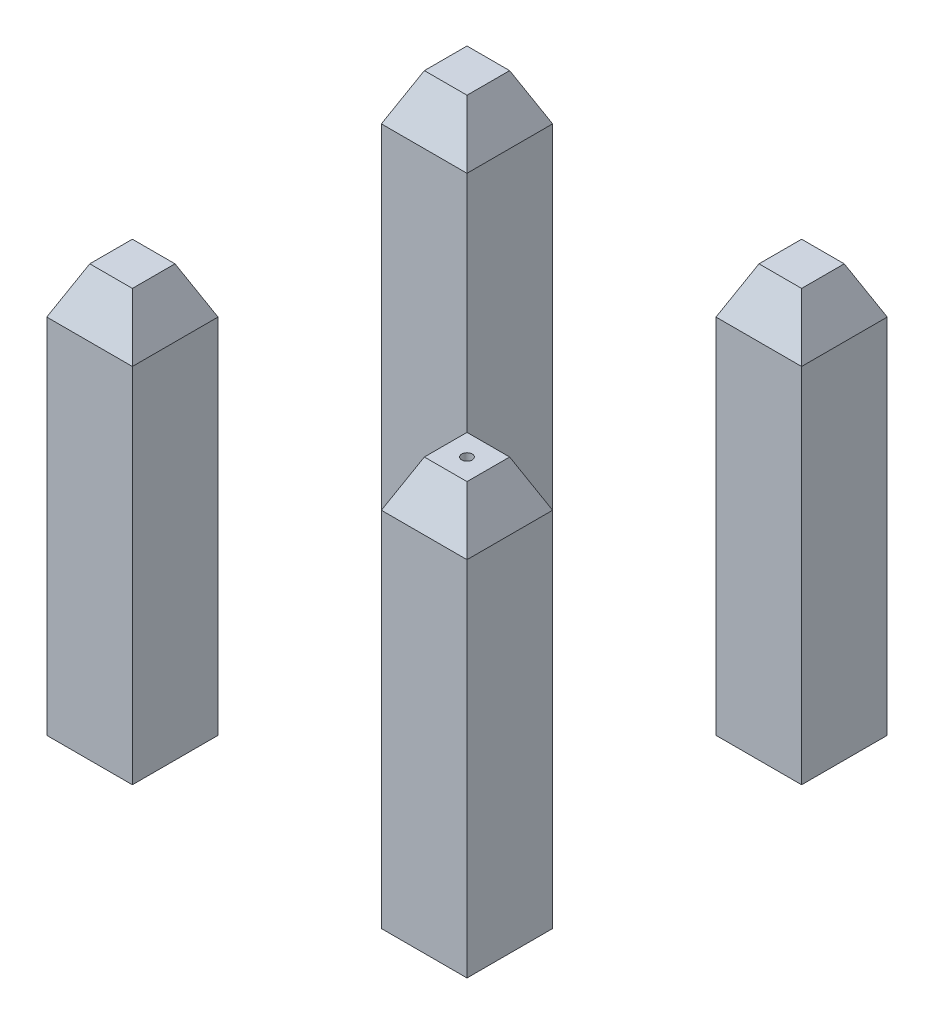
ISO-10303-21;
HEADER;
FILE_DESCRIPTION(('STEP AP214'),'2;1');
FILE_NAME('part.step','',(''),(''),'','','');
FILE_SCHEMA(('AUTOMOTIVE_DESIGN { 1 0 10303 214 1 1 1 1 }'));
ENDSEC;
DATA;
#1=APPLICATION_CONTEXT('core data for automotive mechanical design processes');
#2=APPLICATION_PROTOCOL_DEFINITION('international standard','automotive_design',2000,#1);
#3=PRODUCT_CONTEXT('',#1,'mechanical');
#4=PRODUCT('Part','Part','',(#3));
#5=PRODUCT_RELATED_PRODUCT_CATEGORY('part','',(#4));
#6=PRODUCT_DEFINITION_FORMATION('','',#4);
#7=PRODUCT_DEFINITION_CONTEXT('part definition',#1,'design');
#8=PRODUCT_DEFINITION('design','',#6,#7);
#9=PRODUCT_DEFINITION_SHAPE('','',#8);
#10=(LENGTH_UNIT() NAMED_UNIT(*) SI_UNIT(.MILLI.,.METRE.));
#11=(NAMED_UNIT(*) PLANE_ANGLE_UNIT() SI_UNIT($,.RADIAN.));
#12=(NAMED_UNIT(*) SI_UNIT($,.STERADIAN.) SOLID_ANGLE_UNIT());
#13=UNCERTAINTY_MEASURE_WITH_UNIT(LENGTH_MEASURE(1.E-05),#10,'distance_accuracy_value','');
#14=(GEOMETRIC_REPRESENTATION_CONTEXT(3) GLOBAL_UNCERTAINTY_ASSIGNED_CONTEXT((#13)) GLOBAL_UNIT_ASSIGNED_CONTEXT((#10,
#11,#12)) REPRESENTATION_CONTEXT('',''));
#15=CARTESIAN_POINT('',(0.,0.,0.));
#16=DIRECTION('',(0.,0.,1.));
#17=DIRECTION('',(1.,0.,0.));
#18=AXIS2_PLACEMENT_3D('',#15,#16,#17);
#19=CARTESIAN_POINT('',(-0.325,5.6,-0.325));
#20=DIRECTION('',(1.,0.,0.));
#21=DIRECTION('',(0.,0.,-1.));
#22=AXIS2_PLACEMENT_3D('',#19,#20,#21);
#23=PLANE('',#22);
#24=DIRECTION('',(0.,-1.,0.));
#25=VECTOR('',#24,1.);
#26=CARTESIAN_POINT('',(-0.325,5.6,-0.325));
#27=LINE('',#26,#25);
#28=CARTESIAN_POINT('',(-0.325,5.25,-0.325));
#29=VERTEX_POINT('',#28);
#30=CARTESIAN_POINT('',(-0.325,2.5,-0.325));
#31=VERTEX_POINT('',#30);
#32=EDGE_CURVE('E134',#29,#31,#27,.T.);
#33=ORIENTED_EDGE('',*,*,#32,.T.);
#34=DIRECTION('',(0.,0.,1.));
#35=VECTOR('',#34,1.);
#36=CARTESIAN_POINT('',(-0.325,2.5,-0.325));
#37=LINE('',#36,#35);
#38=CARTESIAN_POINT('',(-0.325,2.5,0.325));
#39=VERTEX_POINT('',#38);
#40=EDGE_CURVE('E75',#31,#39,#37,.T.);
#41=ORIENTED_EDGE('',*,*,#40,.T.);
#42=DIRECTION('',(0.,-1.,0.));
#43=VECTOR('',#42,1.);
#44=CARTESIAN_POINT('',(-0.325,5.6,0.325));
#45=LINE('',#44,#43);
#46=CARTESIAN_POINT('',(-0.325,5.25,0.325));
#47=VERTEX_POINT('',#46);
#48=EDGE_CURVE('E147',#47,#39,#45,.T.);
#49=ORIENTED_EDGE('',*,*,#48,.F.);
#50=DIRECTION('',(0.,0.,-1.));
#51=VECTOR('',#50,1.);
#52=CARTESIAN_POINT('',(-0.325,5.25,-0.325));
#53=LINE('',#52,#51);
#54=EDGE_CURVE('E143',#47,#29,#53,.T.);
#55=ORIENTED_EDGE('',*,*,#54,.T.);
#56=EDGE_LOOP('',(#33,#41,#49,#55));
#57=FACE_BOUND('',#56,.T.);
#58=ADVANCED_FACE('F55',(#57),#23,.F.);
#59=CARTESIAN_POINT('',(-0.325,5.6,0.325));
#60=DIRECTION('',(0.,0.,-1.));
#61=DIRECTION('',(-1.,0.,0.));
#62=AXIS2_PLACEMENT_3D('',#59,#60,#61);
#63=PLANE('',#62);
#64=ORIENTED_EDGE('',*,*,#48,.T.);
#65=DIRECTION('',(1.,0.,0.));
#66=VECTOR('',#65,1.);
#67=CARTESIAN_POINT('',(-0.325,2.5,0.325));
#68=LINE('',#67,#66);
#69=CARTESIAN_POINT('',(0.325,2.5,0.325000000000001));
#70=VERTEX_POINT('',#69);
#71=EDGE_CURVE('E144',#39,#70,#68,.T.);
#72=ORIENTED_EDGE('',*,*,#71,.T.);
#73=DIRECTION('',(0.,-1.,0.));
#74=VECTOR('',#73,1.);
#75=CARTESIAN_POINT('',(0.325,5.6,0.325));
#76=LINE('',#75,#74);
#77=CARTESIAN_POINT('',(0.325,5.25,0.325));
#78=VERTEX_POINT('',#77);
#79=EDGE_CURVE('E119',#78,#70,#76,.T.);
#80=ORIENTED_EDGE('',*,*,#79,.F.);
#81=DIRECTION('',(-1.,0.,0.));
#82=VECTOR('',#81,1.);
#83=CARTESIAN_POINT('',(-0.325,5.25,0.325));
#84=LINE('',#83,#82);
#85=EDGE_CURVE('E146',#78,#47,#84,.T.);
#86=ORIENTED_EDGE('',*,*,#85,.T.);
#87=EDGE_LOOP('',(#64,#72,#80,#86));
#88=FACE_BOUND('',#87,.T.);
#89=ADVANCED_FACE('F194',(#88),#63,.F.);
#90=CARTESIAN_POINT('',(0.325,5.6,-0.325));
#91=DIRECTION('',(-1.,0.,0.));
#92=DIRECTION('',(0.,0.,1.));
#93=AXIS2_PLACEMENT_3D('',#90,#91,#92);
#94=PLANE('',#93);
#95=ORIENTED_EDGE('',*,*,#79,.T.);
#96=DIRECTION('',(0.,0.,-1.));
#97=VECTOR('',#96,1.);
#98=CARTESIAN_POINT('',(0.325,2.5,-0.325));
#99=LINE('',#98,#97);
#100=CARTESIAN_POINT('',(0.325,2.5,-0.325));
#101=VERTEX_POINT('',#100);
#102=EDGE_CURVE('E105',#70,#101,#99,.T.);
#103=ORIENTED_EDGE('',*,*,#102,.T.);
#104=DIRECTION('',(0.,-1.,0.));
#105=VECTOR('',#104,1.);
#106=CARTESIAN_POINT('',(0.325,5.6,-0.325));
#107=LINE('',#106,#105);
#108=CARTESIAN_POINT('',(0.325,5.25,-0.325));
#109=VERTEX_POINT('',#108);
#110=EDGE_CURVE('E113',#109,#101,#107,.T.);
#111=ORIENTED_EDGE('',*,*,#110,.F.);
#112=DIRECTION('',(0.,0.,1.));
#113=VECTOR('',#112,1.);
#114=CARTESIAN_POINT('',(0.325,5.25,0.325));
#115=LINE('',#114,#113);
#116=EDGE_CURVE('E121',#109,#78,#115,.T.);
#117=ORIENTED_EDGE('',*,*,#116,.T.);
#118=EDGE_LOOP('',(#95,#103,#111,#117));
#119=FACE_BOUND('',#118,.T.);
#120=ADVANCED_FACE('F117',(#119),#94,.F.);
#121=CARTESIAN_POINT('',(-0.325,5.6,-0.325));
#122=DIRECTION('',(0.,0.,1.));
#123=DIRECTION('',(1.,0.,0.));
#124=AXIS2_PLACEMENT_3D('',#121,#122,#123);
#125=PLANE('',#124);
#126=ORIENTED_EDGE('',*,*,#110,.T.);
#127=DIRECTION('',(-1.,0.,0.));
#128=VECTOR('',#127,1.);
#129=CARTESIAN_POINT('',(-0.325,2.5,-0.325));
#130=LINE('',#129,#128);
#131=EDGE_CURVE('E59',#101,#31,#130,.T.);
#132=ORIENTED_EDGE('',*,*,#131,.T.);
#133=ORIENTED_EDGE('',*,*,#32,.F.);
#134=DIRECTION('',(1.,0.,0.));
#135=VECTOR('',#134,1.);
#136=CARTESIAN_POINT('',(0.325,5.25,-0.325));
#137=LINE('',#136,#135);
#138=EDGE_CURVE('E112',#29,#109,#137,.T.);
#139=ORIENTED_EDGE('',*,*,#138,.T.);
#140=EDGE_LOOP('',(#126,#132,#133,#139));
#141=FACE_BOUND('',#140,.T.);
#142=ADVANCED_FACE('F123',(#141),#125,.F.);
#143=CARTESIAN_POINT('',(-0.325,5.6,0.325));
#144=DIRECTION('',(0.,1.,0.));
#145=DIRECTION('',(0.,0.,1.));
#146=AXIS2_PLACEMENT_3D('',#143,#144,#145);
#147=PLANE('',#146);
#148=CARTESIAN_POINT('',(0.,5.6,0.));
#149=DIRECTION('',(0.,1.,0.));
#150=DIRECTION('',(0.,0.,1.));
#151=AXIS2_PLACEMENT_3D('',#148,#149,#150);
#152=CIRCLE('',#151,0.0396086677725191);
#153=CARTESIAN_POINT('',(0.,5.6,0.0396086677725191));
#154=VERTEX_POINT('',#153);
#155=EDGE_CURVE('E66',#154,#154,#152,.T.);
#156=ORIENTED_EDGE('',*,*,#155,.F.);
#157=EDGE_LOOP('',(#156));
#158=FACE_BOUND('',#157,.T.);
#159=DIRECTION('',(0.,0.,-1.));
#160=VECTOR('',#159,1.);
#161=CARTESIAN_POINT('',(0.161792319645751,5.6,-0.325));
#162=LINE('',#161,#160);
#163=CARTESIAN_POINT('',(0.161792319645751,5.6,0.161792319645751));
#164=VERTEX_POINT('',#163);
#165=CARTESIAN_POINT('',(0.161792319645751,5.6,-0.161792319645751));
#166=VERTEX_POINT('',#165);
#167=EDGE_CURVE('E166',#164,#166,#162,.T.);
#168=ORIENTED_EDGE('',*,*,#167,.T.);
#169=DIRECTION('',(-1.,0.,0.));
#170=VECTOR('',#169,1.);
#171=CARTESIAN_POINT('',(-0.325,5.6,-0.16179231964575));
#172=LINE('',#171,#170);
#173=CARTESIAN_POINT('',(-0.16179231964575,5.6,-0.16179231964575));
#174=VERTEX_POINT('',#173);
#175=EDGE_CURVE('E162',#166,#174,#172,.T.);
#176=ORIENTED_EDGE('',*,*,#175,.T.);
#177=DIRECTION('',(0.,0.,1.));
#178=VECTOR('',#177,1.);
#179=CARTESIAN_POINT('',(-0.16179231964575,5.6,0.325));
#180=LINE('',#179,#178);
#181=CARTESIAN_POINT('',(-0.16179231964575,5.6,0.161792319645751));
#182=VERTEX_POINT('',#181);
#183=EDGE_CURVE('E158',#174,#182,#180,.T.);
#184=ORIENTED_EDGE('',*,*,#183,.T.);
#185=DIRECTION('',(1.,0.,0.));
#186=VECTOR('',#185,1.);
#187=CARTESIAN_POINT('',(0.325,5.6,0.161792319645751));
#188=LINE('',#187,#186);
#189=EDGE_CURVE('E161',#182,#164,#188,.T.);
#190=ORIENTED_EDGE('',*,*,#189,.T.);
#191=EDGE_LOOP('',(#168,#176,#184,#190));
#192=FACE_BOUND('',#191,.T.);
#193=ADVANCED_FACE('F204',(#158,#192),#147,.T.);
#194=CARTESIAN_POINT('',(-0.325,5.6,0.161792319645751));
#195=DIRECTION('',(0.,0.422618261740697,0.906307787036651));
#196=DIRECTION('',(0.,-0.906307787036651,0.422618261740697));
#197=AXIS2_PLACEMENT_3D('',#194,#195,#196);
#198=PLANE('',#197);
#199=DIRECTION('',(0.389281620635023,0.834817129478989,-0.389281620635023));
#200=VECTOR('',#199,1.);
#201=CARTESIAN_POINT('',(-0.18652484093082,5.54696093694252,0.18652484093082));
#202=LINE('',#201,#200);
#203=EDGE_CURVE('E177',#47,#182,#202,.T.);
#204=ORIENTED_EDGE('',*,*,#203,.F.);
#205=ORIENTED_EDGE('',*,*,#85,.F.);
#206=DIRECTION('',(-0.389281620635023,0.834817129478989,-0.389281620635023));
#207=VECTOR('',#206,1.);
#208=CARTESIAN_POINT('',(0.08802372382407,5.75819726425587,0.08802372382407));
#209=LINE('',#208,#207);
#210=EDGE_CURVE('E165',#164,#78,#209,.F.);
#211=ORIENTED_EDGE('',*,*,#210,.F.);
#212=ORIENTED_EDGE('',*,*,#189,.F.);
#213=EDGE_LOOP('',(#204,#205,#211,#212));
#214=FACE_BOUND('',#213,.T.);
#215=ADVANCED_FACE('F192',(#214),#198,.T.);
#216=CARTESIAN_POINT('',(0.161792319645751,5.6,0.325));
#217=DIRECTION('',(0.906307787036651,0.422618261740697,0.));
#218=DIRECTION('',(-0.422618261740697,0.906307787036651,0.));
#219=AXIS2_PLACEMENT_3D('',#216,#217,#218);
#220=PLANE('',#219);
#221=ORIENTED_EDGE('',*,*,#210,.T.);
#222=ORIENTED_EDGE('',*,*,#116,.F.);
#223=DIRECTION('',(-0.389281620635023,0.834817129478989,0.389281620635023));
#224=VECTOR('',#223,1.);
#225=CARTESIAN_POINT('',(0.08802372382407,5.75819726425587,-0.0880237238240699));
#226=LINE('',#225,#224);
#227=EDGE_CURVE('E174',#166,#109,#226,.F.);
#228=ORIENTED_EDGE('',*,*,#227,.F.);
#229=ORIENTED_EDGE('',*,*,#167,.F.);
#230=EDGE_LOOP('',(#221,#222,#228,#229));
#231=FACE_BOUND('',#230,.T.);
#232=ADVANCED_FACE('F186',(#231),#220,.T.);
#233=CARTESIAN_POINT('',(-0.16179231964575,5.6,0.325));
#234=DIRECTION('',(-0.906307787036651,0.422618261740697,0.));
#235=DIRECTION('',(-0.422618261740697,-0.906307787036651,0.));
#236=AXIS2_PLACEMENT_3D('',#233,#234,#235);
#237=PLANE('',#236);
#238=ORIENTED_EDGE('',*,*,#203,.T.);
#239=ORIENTED_EDGE('',*,*,#183,.F.);
#240=DIRECTION('',(-0.389281620635023,-0.834817129478989,-0.389281620635023));
#241=VECTOR('',#240,1.);
#242=CARTESIAN_POINT('',(-0.08802372382407,5.75819726425587,-0.0880237238240699));
#243=LINE('',#242,#241);
#244=EDGE_CURVE('E139',#29,#174,#243,.F.);
#245=ORIENTED_EDGE('',*,*,#244,.F.);
#246=ORIENTED_EDGE('',*,*,#54,.F.);
#247=EDGE_LOOP('',(#238,#239,#245,#246));
#248=FACE_BOUND('',#247,.T.);
#249=ADVANCED_FACE('F202',(#248),#237,.T.);
#250=CARTESIAN_POINT('',(-0.325,5.6,-0.16179231964575));
#251=DIRECTION('',(0.,0.422618261740697,-0.906307787036651));
#252=DIRECTION('',(0.,0.906307787036651,0.422618261740697));
#253=AXIS2_PLACEMENT_3D('',#250,#251,#252);
#254=PLANE('',#253);
#255=ORIENTED_EDGE('',*,*,#227,.T.);
#256=ORIENTED_EDGE('',*,*,#138,.F.);
#257=ORIENTED_EDGE('',*,*,#244,.T.);
#258=ORIENTED_EDGE('',*,*,#175,.F.);
#259=EDGE_LOOP('',(#255,#256,#257,#258));
#260=FACE_BOUND('',#259,.T.);
#261=ADVANCED_FACE('F198',(#260),#254,.T.);
#262=CARTESIAN_POINT('',(0.,5.5,0.));
#263=DIRECTION('',(0.,1.,0.));
#264=DIRECTION('',(0.,0.,1.));
#265=AXIS2_PLACEMENT_3D('',#262,#263,#264);
#266=CYLINDRICAL_SURFACE('',#265,0.0396086677725191);
#267=CARTESIAN_POINT('',(0.,5.5,0.));
#268=DIRECTION('',(0.,1.,0.));
#269=DIRECTION('',(0.,0.,1.));
#270=AXIS2_PLACEMENT_3D('',#267,#268,#269);
#271=CIRCLE('',#270,0.0396086677725191);
#272=CARTESIAN_POINT('',(0.,5.5,0.0396086677725191));
#273=VERTEX_POINT('',#272);
#274=EDGE_CURVE('E12',#273,#273,#271,.T.);
#275=ORIENTED_EDGE('',*,*,#274,.F.);
#276=EDGE_LOOP('',(#275));
#277=FACE_BOUND('',#276,.T.);
#278=ORIENTED_EDGE('',*,*,#155,.T.);
#279=EDGE_LOOP('',(#278));
#280=FACE_BOUND('',#279,.T.);
#281=ADVANCED_FACE('F261',(#277,#280),#266,.F.);
#282=CARTESIAN_POINT('',(0.,5.5,0.));
#283=DIRECTION('',(0.,1.,0.));
#284=DIRECTION('',(0.,0.,1.));
#285=AXIS2_PLACEMENT_3D('',#282,#283,#284);
#286=PLANE('',#285);
#287=ORIENTED_EDGE('',*,*,#274,.T.);
#288=EDGE_LOOP('',(#287));
#289=FACE_BOUND('',#288,.T.);
#290=ADVANCED_FACE('F268',(#289),#286,.T.);
#291=CARTESIAN_POINT('',(-4.73851357365382,2.5,-49.53));
#292=DIRECTION('',(0.,1.,0.));
#293=DIRECTION('',(-1.,0.,0.));
#294=AXIS2_PLACEMENT_3D('',#291,#292,#293);
#295=PLANE('',#294);
#296=ORIENTED_EDGE('',*,*,#131,.F.);
#297=ORIENTED_EDGE('',*,*,#102,.F.);
#298=ORIENTED_EDGE('',*,*,#71,.F.);
#299=ORIENTED_EDGE('',*,*,#40,.F.);
#300=EDGE_LOOP('',(#296,#297,#298,#299));
#301=FACE_BOUND('',#300,.T.);
#302=ADVANCED_FACE('F57',(#301),#295,.F.);
#303=CLOSED_SHELL('',(#58,#89,#120,#142,#193,#215,#232,#249,#261,#281,#290,#302));
#304=MANIFOLD_SOLID_BREP('B2',#303);
#305=CARTESIAN_POINT('',(-2.865,5.6,-2.215));
#306=DIRECTION('',(0.,1.,0.));
#307=DIRECTION('',(0.,0.,1.));
#308=AXIS2_PLACEMENT_3D('',#305,#306,#307);
#309=PLANE('',#308);
#310=DIRECTION('',(0.,0.,-1.));
#311=VECTOR('',#310,1.);
#312=CARTESIAN_POINT('',(-2.37820768035425,5.6,-2.865));
#313=LINE('',#312,#311);
#314=CARTESIAN_POINT('',(-2.37820768035425,5.6,-2.37820768035425));
#315=VERTEX_POINT('',#314);
#316=CARTESIAN_POINT('',(-2.37820768035425,5.6,-2.70179231964575));
#317=VERTEX_POINT('',#316);
#318=EDGE_CURVE('E437',#315,#317,#313,.T.);
#319=ORIENTED_EDGE('',*,*,#318,.T.);
#320=DIRECTION('',(-1.,0.,0.));
#321=VECTOR('',#320,1.);
#322=CARTESIAN_POINT('',(-2.865,5.6,-2.70179231964575));
#323=LINE('',#322,#321);
#324=CARTESIAN_POINT('',(-2.70179231964575,5.6,-2.70179231964575));
#325=VERTEX_POINT('',#324);
#326=EDGE_CURVE('E434',#317,#325,#323,.T.);
#327=ORIENTED_EDGE('',*,*,#326,.T.);
#328=DIRECTION('',(0.,0.,1.));
#329=VECTOR('',#328,1.);
#330=CARTESIAN_POINT('',(-2.70179231964575,5.6,-2.215));
#331=LINE('',#330,#329);
#332=CARTESIAN_POINT('',(-2.70179231964575,5.6,-2.37820768035425));
#333=VERTEX_POINT('',#332);
#334=EDGE_CURVE('E430',#325,#333,#331,.T.);
#335=ORIENTED_EDGE('',*,*,#334,.T.);
#336=DIRECTION('',(1.,0.,0.));
#337=VECTOR('',#336,1.);
#338=CARTESIAN_POINT('',(-2.215,5.6,-2.37820768035425));
#339=LINE('',#338,#337);
#340=EDGE_CURVE('E433',#333,#315,#339,.T.);
#341=ORIENTED_EDGE('',*,*,#340,.T.);
#342=EDGE_LOOP('',(#319,#327,#335,#341));
#343=FACE_BOUND('',#342,.T.);
#344=ADVANCED_FACE('F332',(#343),#309,.T.);
#345=CARTESIAN_POINT('',(-2.70179231964575,5.6,-2.215));
#346=DIRECTION('',(-0.906307787036651,0.422618261740697,0.));
#347=DIRECTION('',(-0.422618261740697,-0.906307787036651,0.));
#348=AXIS2_PLACEMENT_3D('',#345,#346,#347);
#349=PLANE('',#348);
#350=DIRECTION('',(0.389281620635023,0.83481712947899,-0.389281620635023));
#351=VECTOR('',#350,1.);
#352=CARTESIAN_POINT('',(-2.72652484093082,5.54696093694252,-2.35347515906918));
#353=LINE('',#352,#351);
#354=CARTESIAN_POINT('',(-2.865,5.25,-2.215));
#355=VERTEX_POINT('',#354);
#356=EDGE_CURVE('E436',#355,#333,#353,.T.);
#357=ORIENTED_EDGE('',*,*,#356,.T.);
#358=ORIENTED_EDGE('',*,*,#334,.F.);
#359=DIRECTION('',(-0.389281620635023,-0.83481712947899,-0.389281620635023));
#360=VECTOR('',#359,1.);
#361=CARTESIAN_POINT('',(-2.62802372382407,5.75819726425587,-2.62802372382407));
#362=LINE('',#361,#360);
#363=CARTESIAN_POINT('',(-2.865,5.25,-2.865));
#364=VERTEX_POINT('',#363);
#365=EDGE_CURVE('E401',#364,#325,#362,.F.);
#366=ORIENTED_EDGE('',*,*,#365,.F.);
#367=DIRECTION('',(0.,0.,-1.));
#368=VECTOR('',#367,1.);
#369=CARTESIAN_POINT('',(-2.865,5.25,-2.865));
#370=LINE('',#369,#368);
#371=EDGE_CURVE('E53',#355,#364,#370,.T.);
#372=ORIENTED_EDGE('',*,*,#371,.F.);
#373=EDGE_LOOP('',(#357,#358,#366,#372));
#374=FACE_BOUND('',#373,.T.);
#375=ADVANCED_FACE('F473',(#374),#349,.T.);
#376=CARTESIAN_POINT('',(-2.865,5.6,-2.37820768035425));
#377=DIRECTION('',(0.,0.422618261740697,0.906307787036651));
#378=DIRECTION('',(0.,-0.906307787036651,0.422618261740697));
#379=AXIS2_PLACEMENT_3D('',#376,#377,#378);
#380=PLANE('',#379);
#381=ORIENTED_EDGE('',*,*,#356,.F.);
#382=DIRECTION('',(-1.,0.,0.));
#383=VECTOR('',#382,1.);
#384=CARTESIAN_POINT('',(-2.865,5.25,-2.215));
#385=LINE('',#384,#383);
#386=CARTESIAN_POINT('',(-2.215,5.25,-2.215));
#387=VERTEX_POINT('',#386);
#388=EDGE_CURVE('E414',#387,#355,#385,.T.);
#389=ORIENTED_EDGE('',*,*,#388,.F.);
#390=DIRECTION('',(-0.389281620635023,0.83481712947899,-0.389281620635023));
#391=VECTOR('',#390,1.);
#392=CARTESIAN_POINT('',(-2.45197627617593,5.75819726425587,-2.45197627617593));
#393=LINE('',#392,#391);
#394=EDGE_CURVE('E445',#315,#387,#393,.F.);
#395=ORIENTED_EDGE('',*,*,#394,.F.);
#396=ORIENTED_EDGE('',*,*,#340,.F.);
#397=EDGE_LOOP('',(#381,#389,#395,#396));
#398=FACE_BOUND('',#397,.T.);
#399=ADVANCED_FACE('F462',(#398),#380,.T.);
#400=CARTESIAN_POINT('',(-2.37820768035425,5.6,-2.215));
#401=DIRECTION('',(0.906307787036651,0.422618261740697,0.));
#402=DIRECTION('',(-0.422618261740697,0.906307787036651,0.));
#403=AXIS2_PLACEMENT_3D('',#400,#401,#402);
#404=PLANE('',#403);
#405=ORIENTED_EDGE('',*,*,#394,.T.);
#406=DIRECTION('',(0.,0.,1.));
#407=VECTOR('',#406,1.);
#408=CARTESIAN_POINT('',(-2.215,5.25,-2.215));
#409=LINE('',#408,#407);
#410=CARTESIAN_POINT('',(-2.215,5.25,-2.865));
#411=VERTEX_POINT('',#410);
#412=EDGE_CURVE('E396',#411,#387,#409,.T.);
#413=ORIENTED_EDGE('',*,*,#412,.F.);
#414=DIRECTION('',(-0.389281620635023,0.83481712947899,0.389281620635023));
#415=VECTOR('',#414,1.);
#416=CARTESIAN_POINT('',(-2.45197627617593,5.75819726425587,-2.62802372382407));
#417=LINE('',#416,#415);
#418=EDGE_CURVE('E406',#317,#411,#417,.F.);
#419=ORIENTED_EDGE('',*,*,#418,.F.);
#420=ORIENTED_EDGE('',*,*,#318,.F.);
#421=EDGE_LOOP('',(#405,#413,#419,#420));
#422=FACE_BOUND('',#421,.T.);
#423=ADVANCED_FACE('F456',(#422),#404,.T.);
#424=CARTESIAN_POINT('',(-2.865,5.6,-2.70179231964575));
#425=DIRECTION('',(0.,0.422618261740697,-0.906307787036651));
#426=DIRECTION('',(0.,0.906307787036651,0.422618261740697));
#427=AXIS2_PLACEMENT_3D('',#424,#425,#426);
#428=PLANE('',#427);
#429=ORIENTED_EDGE('',*,*,#418,.T.);
#430=DIRECTION('',(1.,0.,0.));
#431=VECTOR('',#430,1.);
#432=CARTESIAN_POINT('',(-2.215,5.25,-2.865));
#433=LINE('',#432,#431);
#434=EDGE_CURVE('E387',#364,#411,#433,.T.);
#435=ORIENTED_EDGE('',*,*,#434,.F.);
#436=ORIENTED_EDGE('',*,*,#365,.T.);
#437=ORIENTED_EDGE('',*,*,#326,.F.);
#438=EDGE_LOOP('',(#429,#435,#436,#437));
#439=FACE_BOUND('',#438,.T.);
#440=ADVANCED_FACE('F469',(#439),#428,.T.);
#441=CARTESIAN_POINT('',(-2.865,5.6,-2.865));
#442=DIRECTION('',(0.,0.,1.));
#443=DIRECTION('',(1.,0.,0.));
#444=AXIS2_PLACEMENT_3D('',#441,#442,#443);
#445=PLANE('',#444);
#446=DIRECTION('',(0.,-1.,0.));
#447=VECTOR('',#446,1.);
#448=CARTESIAN_POINT('',(-2.215,5.6,-2.865));
#449=LINE('',#448,#447);
#450=CARTESIAN_POINT('',(-2.215,2.5,-2.865));
#451=VERTEX_POINT('',#450);
#452=EDGE_CURVE('E388',#411,#451,#449,.T.);
#453=ORIENTED_EDGE('',*,*,#452,.T.);
#454=DIRECTION('',(-1.,0.,0.));
#455=VECTOR('',#454,1.);
#456=CARTESIAN_POINT('',(-2.865,2.5,-2.865));
#457=LINE('',#456,#455);
#458=CARTESIAN_POINT('',(-2.865,2.5,-2.865));
#459=VERTEX_POINT('',#458);
#460=EDGE_CURVE('E336',#451,#459,#457,.T.);
#461=ORIENTED_EDGE('',*,*,#460,.T.);
#462=DIRECTION('',(0.,-1.,0.));
#463=VECTOR('',#462,1.);
#464=CARTESIAN_POINT('',(-2.865,5.6,-2.865));
#465=LINE('',#464,#463);
#466=EDGE_CURVE('E411',#364,#459,#465,.T.);
#467=ORIENTED_EDGE('',*,*,#466,.F.);
#468=ORIENTED_EDGE('',*,*,#434,.T.);
#469=EDGE_LOOP('',(#453,#461,#467,#468));
#470=FACE_BOUND('',#469,.T.);
#471=ADVANCED_FACE('F398',(#470),#445,.F.);
#472=CARTESIAN_POINT('',(-2.215,5.6,-2.865));
#473=DIRECTION('',(-1.,0.,0.));
#474=DIRECTION('',(0.,0.,1.));
#475=AXIS2_PLACEMENT_3D('',#472,#473,#474);
#476=PLANE('',#475);
#477=DIRECTION('',(0.,-1.,0.));
#478=VECTOR('',#477,1.);
#479=CARTESIAN_POINT('',(-2.215,5.6,-2.215));
#480=LINE('',#479,#478);
#481=CARTESIAN_POINT('',(-2.215,2.5,-2.215));
#482=VERTEX_POINT('',#481);
#483=EDGE_CURVE('E394',#387,#482,#480,.T.);
#484=ORIENTED_EDGE('',*,*,#483,.T.);
#485=DIRECTION('',(0.,0.,-1.));
#486=VECTOR('',#485,1.);
#487=CARTESIAN_POINT('',(-2.215,2.5,-2.865));
#488=LINE('',#487,#486);
#489=EDGE_CURVE('E380',#482,#451,#488,.T.);
#490=ORIENTED_EDGE('',*,*,#489,.T.);
#491=ORIENTED_EDGE('',*,*,#452,.F.);
#492=ORIENTED_EDGE('',*,*,#412,.T.);
#493=EDGE_LOOP('',(#484,#490,#491,#492));
#494=FACE_BOUND('',#493,.T.);
#495=ADVANCED_FACE('F392',(#494),#476,.F.);
#496=CARTESIAN_POINT('',(-2.865,5.6,-2.215));
#497=DIRECTION('',(0.,0.,-1.));
#498=DIRECTION('',(-1.,0.,0.));
#499=AXIS2_PLACEMENT_3D('',#496,#497,#498);
#500=PLANE('',#499);
#501=DIRECTION('',(0.,-1.,0.));
#502=VECTOR('',#501,1.);
#503=CARTESIAN_POINT('',(-2.865,5.6,-2.215));
#504=LINE('',#503,#502);
#505=CARTESIAN_POINT('',(-2.865,2.5,-2.215));
#506=VERTEX_POINT('',#505);
#507=EDGE_CURVE('E419',#355,#506,#504,.T.);
#508=ORIENTED_EDGE('',*,*,#507,.T.);
#509=DIRECTION('',(1.,0.,0.));
#510=VECTOR('',#509,1.);
#511=CARTESIAN_POINT('',(-2.865,2.5,-2.215));
#512=LINE('',#511,#510);
#513=EDGE_CURVE('E417',#506,#482,#512,.T.);
#514=ORIENTED_EDGE('',*,*,#513,.T.);
#515=ORIENTED_EDGE('',*,*,#483,.F.);
#516=ORIENTED_EDGE('',*,*,#388,.T.);
#517=EDGE_LOOP('',(#508,#514,#515,#516));
#518=FACE_BOUND('',#517,.T.);
#519=ADVANCED_FACE('F464',(#518),#500,.F.);
#520=CARTESIAN_POINT('',(-2.865,5.6,-2.865));
#521=DIRECTION('',(1.,0.,0.));
#522=DIRECTION('',(0.,0.,-1.));
#523=AXIS2_PLACEMENT_3D('',#520,#521,#522);
#524=PLANE('',#523);
#525=ORIENTED_EDGE('',*,*,#466,.T.);
#526=DIRECTION('',(0.,0.,1.));
#527=VECTOR('',#526,1.);
#528=CARTESIAN_POINT('',(-2.865,2.5,-2.865));
#529=LINE('',#528,#527);
#530=EDGE_CURVE('E343',#459,#506,#529,.T.);
#531=ORIENTED_EDGE('',*,*,#530,.T.);
#532=ORIENTED_EDGE('',*,*,#507,.F.);
#533=ORIENTED_EDGE('',*,*,#371,.T.);
#534=EDGE_LOOP('',(#525,#531,#532,#533));
#535=FACE_BOUND('',#534,.T.);
#536=ADVANCED_FACE('F466',(#535),#524,.F.);
#537=CARTESIAN_POINT('',(-4.73851357365382,2.5,-49.53));
#538=DIRECTION('',(0.,1.,0.));
#539=DIRECTION('',(-1.,0.,0.));
#540=AXIS2_PLACEMENT_3D('',#537,#538,#539);
#541=PLANE('',#540);
#542=ORIENTED_EDGE('',*,*,#460,.F.);
#543=ORIENTED_EDGE('',*,*,#489,.F.);
#544=ORIENTED_EDGE('',*,*,#513,.F.);
#545=ORIENTED_EDGE('',*,*,#530,.F.);
#546=EDGE_LOOP('',(#542,#543,#544,#545));
#547=FACE_BOUND('',#546,.T.);
#548=ADVANCED_FACE('F334',(#547),#541,.F.);
#549=CLOSED_SHELL('',(#344,#375,#399,#423,#440,#471,#495,#519,#536,#548));
#550=MANIFOLD_SOLID_BREP('B6',#549);
#551=CARTESIAN_POINT('',(-0.325,5.6,-2.215));
#552=DIRECTION('',(0.,1.,0.));
#553=DIRECTION('',(0.,0.,1.));
#554=AXIS2_PLACEMENT_3D('',#551,#552,#553);
#555=PLANE('',#554);
#556=DIRECTION('',(0.,0.,-1.));
#557=VECTOR('',#556,1.);
#558=CARTESIAN_POINT('',(0.16179231964575,5.6,-2.865));
#559=LINE('',#558,#557);
#560=CARTESIAN_POINT('',(0.16179231964575,5.6,-2.37820768035425));
#561=VERTEX_POINT('',#560);
#562=CARTESIAN_POINT('',(0.16179231964575,5.6,-2.70179231964575));
#563=VERTEX_POINT('',#562);
#564=EDGE_CURVE('E678',#561,#563,#559,.T.);
#565=ORIENTED_EDGE('',*,*,#564,.T.);
#566=DIRECTION('',(-1.,0.,0.));
#567=VECTOR('',#566,1.);
#568=CARTESIAN_POINT('',(-0.325,5.6,-2.70179231964575));
#569=LINE('',#568,#567);
#570=CARTESIAN_POINT('',(-0.161792319645751,5.6,-2.70179231964575));
#571=VERTEX_POINT('',#570);
#572=EDGE_CURVE('E675',#563,#571,#569,.T.);
#573=ORIENTED_EDGE('',*,*,#572,.T.);
#574=DIRECTION('',(0.,0.,1.));
#575=VECTOR('',#574,1.);
#576=CARTESIAN_POINT('',(-0.161792319645751,5.6,-2.215));
#577=LINE('',#576,#575);
#578=CARTESIAN_POINT('',(-0.161792319645751,5.6,-2.37820768035425));
#579=VERTEX_POINT('',#578);
#580=EDGE_CURVE('E671',#571,#579,#577,.T.);
#581=ORIENTED_EDGE('',*,*,#580,.T.);
#582=DIRECTION('',(1.,0.,0.));
#583=VECTOR('',#582,1.);
#584=CARTESIAN_POINT('',(0.325,5.6,-2.37820768035425));
#585=LINE('',#584,#583);
#586=EDGE_CURVE('E674',#579,#561,#585,.T.);
#587=ORIENTED_EDGE('',*,*,#586,.T.);
#588=EDGE_LOOP('',(#565,#573,#581,#587));
#589=FACE_BOUND('',#588,.T.);
#590=ADVANCED_FACE('F574',(#589),#555,.T.);
#591=CARTESIAN_POINT('',(-0.161792319645751,5.6,-2.215));
#592=DIRECTION('',(-0.906307787036651,0.422618261740697,0.));
#593=DIRECTION('',(-0.422618261740697,-0.906307787036651,0.));
#594=AXIS2_PLACEMENT_3D('',#591,#592,#593);
#595=PLANE('',#594);
#596=DIRECTION('',(0.389281620635023,0.834817129478989,-0.389281620635023));
#597=VECTOR('',#596,1.);
#598=CARTESIAN_POINT('',(-0.18652484093082,5.54696093694252,-2.35347515906918));
#599=LINE('',#598,#597);
#600=CARTESIAN_POINT('',(-0.325,5.25,-2.215));
#601=VERTEX_POINT('',#600);
#602=EDGE_CURVE('E677',#601,#579,#599,.T.);
#603=ORIENTED_EDGE('',*,*,#602,.T.);
#604=ORIENTED_EDGE('',*,*,#580,.F.);
#605=DIRECTION('',(-0.389281620635023,-0.83481712947899,-0.389281620635023));
#606=VECTOR('',#605,1.);
#607=CARTESIAN_POINT('',(-0.0880237238240703,5.75819726425587,-2.62802372382407));
#608=LINE('',#607,#606);
#609=CARTESIAN_POINT('',(-0.325,5.25,-2.865));
#610=VERTEX_POINT('',#609);
#611=EDGE_CURVE('E643',#610,#571,#608,.F.);
#612=ORIENTED_EDGE('',*,*,#611,.F.);
#613=DIRECTION('',(0.,0.,-1.));
#614=VECTOR('',#613,1.);
#615=CARTESIAN_POINT('',(-0.325,5.25,-2.865));
#616=LINE('',#615,#614);
#617=EDGE_CURVE('E330',#601,#610,#616,.T.);
#618=ORIENTED_EDGE('',*,*,#617,.F.);
#619=EDGE_LOOP('',(#603,#604,#612,#618));
#620=FACE_BOUND('',#619,.T.);
#621=ADVANCED_FACE('F715',(#620),#595,.T.);
#622=CARTESIAN_POINT('',(-0.325,5.6,-2.37820768035425));
#623=DIRECTION('',(0.,0.422618261740697,0.906307787036651));
#624=DIRECTION('',(0.,-0.906307787036651,0.422618261740697));
#625=AXIS2_PLACEMENT_3D('',#622,#623,#624);
#626=PLANE('',#625);
#627=ORIENTED_EDGE('',*,*,#602,.F.);
#628=DIRECTION('',(-1.,0.,0.));
#629=VECTOR('',#628,1.);
#630=CARTESIAN_POINT('',(-0.325,5.25,-2.215));
#631=LINE('',#630,#629);
#632=CARTESIAN_POINT('',(0.325,5.25,-2.215));
#633=VERTEX_POINT('',#632);
#634=EDGE_CURVE('E656',#633,#601,#631,.T.);
#635=ORIENTED_EDGE('',*,*,#634,.F.);
#636=DIRECTION('',(-0.389281620635023,0.83481712947899,-0.389281620635023));
#637=VECTOR('',#636,1.);
#638=CARTESIAN_POINT('',(0.0880237238240698,5.75819726425587,-2.45197627617593));
#639=LINE('',#638,#637);
#640=EDGE_CURVE('E688',#561,#633,#639,.F.);
#641=ORIENTED_EDGE('',*,*,#640,.F.);
#642=ORIENTED_EDGE('',*,*,#586,.F.);
#643=EDGE_LOOP('',(#627,#635,#641,#642));
#644=FACE_BOUND('',#643,.T.);
#645=ADVANCED_FACE('F704',(#644),#626,.T.);
#646=CARTESIAN_POINT('',(0.16179231964575,5.6,-2.215));
#647=DIRECTION('',(0.906307787036651,0.422618261740697,0.));
#648=DIRECTION('',(-0.422618261740697,0.906307787036651,0.));
#649=AXIS2_PLACEMENT_3D('',#646,#647,#648);
#650=PLANE('',#649);
#651=ORIENTED_EDGE('',*,*,#640,.T.);
#652=DIRECTION('',(0.,0.,1.));
#653=VECTOR('',#652,1.);
#654=CARTESIAN_POINT('',(0.325,5.25,-2.215));
#655=LINE('',#654,#653);
#656=CARTESIAN_POINT('',(0.325,5.25,-2.865));
#657=VERTEX_POINT('',#656);
#658=EDGE_CURVE('E638',#657,#633,#655,.T.);
#659=ORIENTED_EDGE('',*,*,#658,.F.);
#660=DIRECTION('',(-0.389281620635023,0.834817129478989,0.389281620635023));
#661=VECTOR('',#660,1.);
#662=CARTESIAN_POINT('',(0.0880237238240697,5.75819726425587,-2.62802372382407));
#663=LINE('',#662,#661);
#664=EDGE_CURVE('E648',#563,#657,#663,.F.);
#665=ORIENTED_EDGE('',*,*,#664,.F.);
#666=ORIENTED_EDGE('',*,*,#564,.F.);
#667=EDGE_LOOP('',(#651,#659,#665,#666));
#668=FACE_BOUND('',#667,.T.);
#669=ADVANCED_FACE('F698',(#668),#650,.T.);
#670=CARTESIAN_POINT('',(-0.325,5.6,-2.70179231964575));
#671=DIRECTION('',(0.,0.422618261740697,-0.906307787036651));
#672=DIRECTION('',(0.,0.906307787036651,0.422618261740697));
#673=AXIS2_PLACEMENT_3D('',#670,#671,#672);
#674=PLANE('',#673);
#675=ORIENTED_EDGE('',*,*,#664,.T.);
#676=DIRECTION('',(1.,0.,0.));
#677=VECTOR('',#676,1.);
#678=CARTESIAN_POINT('',(0.325,5.25,-2.865));
#679=LINE('',#678,#677);
#680=EDGE_CURVE('E629',#610,#657,#679,.T.);
#681=ORIENTED_EDGE('',*,*,#680,.F.);
#682=ORIENTED_EDGE('',*,*,#611,.T.);
#683=ORIENTED_EDGE('',*,*,#572,.F.);
#684=EDGE_LOOP('',(#675,#681,#682,#683));
#685=FACE_BOUND('',#684,.T.);
#686=ADVANCED_FACE('F711',(#685),#674,.T.);
#687=CARTESIAN_POINT('',(-0.325,5.6,-2.865));
#688=DIRECTION('',(0.,0.,1.));
#689=DIRECTION('',(1.,0.,0.));
#690=AXIS2_PLACEMENT_3D('',#687,#688,#689);
#691=PLANE('',#690);
#692=DIRECTION('',(0.,-1.,0.));
#693=VECTOR('',#692,1.);
#694=CARTESIAN_POINT('',(0.325,5.6,-2.865));
#695=LINE('',#694,#693);
#696=CARTESIAN_POINT('',(0.325,2.5,-2.865));
#697=VERTEX_POINT('',#696);
#698=EDGE_CURVE('E630',#657,#697,#695,.T.);
#699=ORIENTED_EDGE('',*,*,#698,.T.);
#700=DIRECTION('',(-1.,0.,0.));
#701=VECTOR('',#700,1.);
#702=CARTESIAN_POINT('',(-0.325,2.5,-2.865));
#703=LINE('',#702,#701);
#704=CARTESIAN_POINT('',(-0.325,2.5,-2.865));
#705=VERTEX_POINT('',#704);
#706=EDGE_CURVE('E578',#697,#705,#703,.T.);
#707=ORIENTED_EDGE('',*,*,#706,.T.);
#708=DIRECTION('',(0.,-1.,0.));
#709=VECTOR('',#708,1.);
#710=CARTESIAN_POINT('',(-0.325,5.6,-2.865));
#711=LINE('',#710,#709);
#712=EDGE_CURVE('E653',#610,#705,#711,.T.);
#713=ORIENTED_EDGE('',*,*,#712,.F.);
#714=ORIENTED_EDGE('',*,*,#680,.T.);
#715=EDGE_LOOP('',(#699,#707,#713,#714));
#716=FACE_BOUND('',#715,.T.);
#717=ADVANCED_FACE('F640',(#716),#691,.F.);
#718=CARTESIAN_POINT('',(0.325,5.6,-2.865));
#719=DIRECTION('',(-1.,0.,0.));
#720=DIRECTION('',(0.,0.,1.));
#721=AXIS2_PLACEMENT_3D('',#718,#719,#720);
#722=PLANE('',#721);
#723=DIRECTION('',(0.,-1.,0.));
#724=VECTOR('',#723,1.);
#725=CARTESIAN_POINT('',(0.325,5.6,-2.215));
#726=LINE('',#725,#724);
#727=CARTESIAN_POINT('',(0.325,2.5,-2.215));
#728=VERTEX_POINT('',#727);
#729=EDGE_CURVE('E636',#633,#728,#726,.T.);
#730=ORIENTED_EDGE('',*,*,#729,.T.);
#731=DIRECTION('',(0.,0.,-1.));
#732=VECTOR('',#731,1.);
#733=CARTESIAN_POINT('',(0.325,2.5,-2.865));
#734=LINE('',#733,#732);
#735=EDGE_CURVE('E622',#728,#697,#734,.T.);
#736=ORIENTED_EDGE('',*,*,#735,.T.);
#737=ORIENTED_EDGE('',*,*,#698,.F.);
#738=ORIENTED_EDGE('',*,*,#658,.T.);
#739=EDGE_LOOP('',(#730,#736,#737,#738));
#740=FACE_BOUND('',#739,.T.);
#741=ADVANCED_FACE('F634',(#740),#722,.F.);
#742=CARTESIAN_POINT('',(-0.325,5.6,-2.215));
#743=DIRECTION('',(0.,0.,-1.));
#744=DIRECTION('',(-1.,0.,0.));
#745=AXIS2_PLACEMENT_3D('',#742,#743,#744);
#746=PLANE('',#745);
#747=DIRECTION('',(0.,-1.,0.));
#748=VECTOR('',#747,1.);
#749=CARTESIAN_POINT('',(-0.325,5.6,-2.215));
#750=LINE('',#749,#748);
#751=CARTESIAN_POINT('',(-0.325,2.5,-2.215));
#752=VERTEX_POINT('',#751);
#753=EDGE_CURVE('E661',#601,#752,#750,.T.);
#754=ORIENTED_EDGE('',*,*,#753,.T.);
#755=DIRECTION('',(1.,0.,0.));
#756=VECTOR('',#755,1.);
#757=CARTESIAN_POINT('',(-0.325,2.5,-2.215));
#758=LINE('',#757,#756);
#759=EDGE_CURVE('E659',#752,#728,#758,.T.);
#760=ORIENTED_EDGE('',*,*,#759,.T.);
#761=ORIENTED_EDGE('',*,*,#729,.F.);
#762=ORIENTED_EDGE('',*,*,#634,.T.);
#763=EDGE_LOOP('',(#754,#760,#761,#762));
#764=FACE_BOUND('',#763,.T.);
#765=ADVANCED_FACE('F706',(#764),#746,.F.);
#766=CARTESIAN_POINT('',(-0.325,5.6,-2.865));
#767=DIRECTION('',(1.,0.,0.));
#768=DIRECTION('',(0.,0.,-1.));
#769=AXIS2_PLACEMENT_3D('',#766,#767,#768);
#770=PLANE('',#769);
#771=ORIENTED_EDGE('',*,*,#712,.T.);
#772=DIRECTION('',(0.,0.,1.));
#773=VECTOR('',#772,1.);
#774=CARTESIAN_POINT('',(-0.325,2.5,-2.865));
#775=LINE('',#774,#773);
#776=EDGE_CURVE('E585',#705,#752,#775,.T.);
#777=ORIENTED_EDGE('',*,*,#776,.T.);
#778=ORIENTED_EDGE('',*,*,#753,.F.);
#779=ORIENTED_EDGE('',*,*,#617,.T.);
#780=EDGE_LOOP('',(#771,#777,#778,#779));
#781=FACE_BOUND('',#780,.T.);
#782=ADVANCED_FACE('F708',(#781),#770,.F.);
#783=CARTESIAN_POINT('',(-4.73851357365382,2.5,-49.53));
#784=DIRECTION('',(0.,1.,0.));
#785=DIRECTION('',(-1.,0.,0.));
#786=AXIS2_PLACEMENT_3D('',#783,#784,#785);
#787=PLANE('',#786);
#788=ORIENTED_EDGE('',*,*,#706,.F.);
#789=ORIENTED_EDGE('',*,*,#735,.F.);
#790=ORIENTED_EDGE('',*,*,#759,.F.);
#791=ORIENTED_EDGE('',*,*,#776,.F.);
#792=EDGE_LOOP('',(#788,#789,#790,#791));
#793=FACE_BOUND('',#792,.T.);
#794=ADVANCED_FACE('F576',(#793),#787,.F.);
#795=CLOSED_SHELL('',(#590,#621,#645,#669,#686,#717,#741,#765,#782,#794));
#796=MANIFOLD_SOLID_BREP('B47',#795);
#797=CARTESIAN_POINT('',(-2.865,5.6,0.325));
#798=DIRECTION('',(0.,1.,0.));
#799=DIRECTION('',(0.,0.,1.));
#800=AXIS2_PLACEMENT_3D('',#797,#798,#799);
#801=PLANE('',#800);
#802=DIRECTION('',(0.,0.,-1.));
#803=VECTOR('',#802,1.);
#804=CARTESIAN_POINT('',(-2.37820768035425,5.6,-0.325));
#805=LINE('',#804,#803);
#806=CARTESIAN_POINT('',(-2.37820768035425,5.6,0.161792319645751));
#807=VERTEX_POINT('',#806);
#808=CARTESIAN_POINT('',(-2.37820768035425,5.6,-0.161792319645751));
#809=VERTEX_POINT('',#808);
#810=EDGE_CURVE('E902',#807,#809,#805,.T.);
#811=ORIENTED_EDGE('',*,*,#810,.T.);
#812=DIRECTION('',(-1.,0.,0.));
#813=VECTOR('',#812,1.);
#814=CARTESIAN_POINT('',(-2.865,5.6,-0.161792319645751));
#815=LINE('',#814,#813);
#816=CARTESIAN_POINT('',(-2.70179231964575,5.6,-0.161792319645751));
#817=VERTEX_POINT('',#816);
#818=EDGE_CURVE('E905',#809,#817,#815,.T.);
#819=ORIENTED_EDGE('',*,*,#818,.T.);
#820=DIRECTION('',(0.,0.,1.));
#821=VECTOR('',#820,1.);
#822=CARTESIAN_POINT('',(-2.70179231964575,5.6,0.325));
#823=LINE('',#822,#821);
#824=CARTESIAN_POINT('',(-2.70179231964575,5.6,0.161792319645751));
#825=VERTEX_POINT('',#824);
#826=EDGE_CURVE('E896',#817,#825,#823,.T.);
#827=ORIENTED_EDGE('',*,*,#826,.T.);
#828=DIRECTION('',(1.,0.,0.));
#829=VECTOR('',#828,1.);
#830=CARTESIAN_POINT('',(-2.215,5.6,0.161792319645751));
#831=LINE('',#830,#829);
#832=EDGE_CURVE('E899',#825,#807,#831,.T.);
#833=ORIENTED_EDGE('',*,*,#832,.T.);
#834=EDGE_LOOP('',(#811,#819,#827,#833));
#835=FACE_BOUND('',#834,.T.);
#836=ADVANCED_FACE('F807',(#835),#801,.T.);
#837=CARTESIAN_POINT('',(-2.70179231964575,5.6,0.325));
#838=DIRECTION('',(-0.906307787036651,0.422618261740697,0.));
#839=DIRECTION('',(-0.422618261740697,-0.906307787036651,0.));
#840=AXIS2_PLACEMENT_3D('',#837,#838,#839);
#841=PLANE('',#840);
#842=DIRECTION('',(0.389281620635023,0.83481712947899,-0.389281620635023));
#843=VECTOR('',#842,1.);
#844=CARTESIAN_POINT('',(-2.72652484093082,5.54696093694252,0.18652484093082));
#845=LINE('',#844,#843);
#846=CARTESIAN_POINT('',(-2.865,5.25,0.325));
#847=VERTEX_POINT('',#846);
#848=EDGE_CURVE('E921',#847,#825,#845,.T.);
#849=ORIENTED_EDGE('',*,*,#848,.T.);
#850=ORIENTED_EDGE('',*,*,#826,.F.);
#851=DIRECTION('',(-0.389281620635023,-0.83481712947899,-0.389281620635023));
#852=VECTOR('',#851,1.);
#853=CARTESIAN_POINT('',(-2.62802372382407,5.75819726425587,-0.0880237238240701));
#854=LINE('',#853,#852);
#855=CARTESIAN_POINT('',(-2.865,5.25,-0.325));
#856=VERTEX_POINT('',#855);
#857=EDGE_CURVE('E916',#856,#817,#854,.F.);
#858=ORIENTED_EDGE('',*,*,#857,.F.);
#859=DIRECTION('',(0.,0.,-1.));
#860=VECTOR('',#859,1.);
#861=CARTESIAN_POINT('',(-2.865,5.25,-0.325));
#862=LINE('',#861,#860);
#863=EDGE_CURVE('E572',#847,#856,#862,.T.);
#864=ORIENTED_EDGE('',*,*,#863,.F.);
#865=EDGE_LOOP('',(#849,#850,#858,#864));
#866=FACE_BOUND('',#865,.T.);
#867=ADVANCED_FACE('F939',(#866),#841,.T.);
#868=CARTESIAN_POINT('',(-2.865,5.6,0.161792319645751));
#869=DIRECTION('',(0.,0.422618261740697,0.906307787036651));
#870=DIRECTION('',(0.,-0.906307787036651,0.422618261740697));
#871=AXIS2_PLACEMENT_3D('',#868,#869,#870);
#872=PLANE('',#871);
#873=ORIENTED_EDGE('',*,*,#848,.F.);
#874=DIRECTION('',(-1.,0.,0.));
#875=VECTOR('',#874,1.);
#876=CARTESIAN_POINT('',(-2.865,5.25,0.325));
#877=LINE('',#876,#875);
#878=CARTESIAN_POINT('',(-2.215,5.25,0.325));
#879=VERTEX_POINT('',#878);
#880=EDGE_CURVE('E817',#879,#847,#877,.T.);
#881=ORIENTED_EDGE('',*,*,#880,.F.);
#882=DIRECTION('',(-0.389281620635023,0.83481712947899,-0.389281620635023));
#883=VECTOR('',#882,1.);
#884=CARTESIAN_POINT('',(-2.45197627617593,5.75819726425587,0.0880237238240702));
#885=LINE('',#884,#883);
#886=EDGE_CURVE('E811',#807,#879,#885,.F.);
#887=ORIENTED_EDGE('',*,*,#886,.F.);
#888=ORIENTED_EDGE('',*,*,#832,.F.);
#889=EDGE_LOOP('',(#873,#881,#887,#888));
#890=FACE_BOUND('',#889,.T.);
#891=ADVANCED_FACE('F809',(#890),#872,.T.);
#892=CARTESIAN_POINT('',(-2.37820768035425,5.6,0.325));
#893=DIRECTION('',(0.906307787036651,0.422618261740697,0.));
#894=DIRECTION('',(-0.422618261740697,0.906307787036651,0.));
#895=AXIS2_PLACEMENT_3D('',#892,#893,#894);
#896=PLANE('',#895);
#897=ORIENTED_EDGE('',*,*,#886,.T.);
#898=DIRECTION('',(0.,0.,1.));
#899=VECTOR('',#898,1.);
#900=CARTESIAN_POINT('',(-2.215,5.25,0.325));
#901=LINE('',#900,#899);
#902=CARTESIAN_POINT('',(-2.215,5.25,-0.325));
#903=VERTEX_POINT('',#902);
#904=EDGE_CURVE('E911',#903,#879,#901,.T.);
#905=ORIENTED_EDGE('',*,*,#904,.F.);
#906=DIRECTION('',(-0.389281620635023,0.83481712947899,0.389281620635023));
#907=VECTOR('',#906,1.);
#908=CARTESIAN_POINT('',(-2.45197627617593,5.75819726425587,-0.0880237238240702));
#909=LINE('',#908,#907);
#910=EDGE_CURVE('E919',#809,#903,#909,.F.);
#911=ORIENTED_EDGE('',*,*,#910,.F.);
#912=ORIENTED_EDGE('',*,*,#810,.F.);
#913=EDGE_LOOP('',(#897,#905,#911,#912));
#914=FACE_BOUND('',#913,.T.);
#915=ADVANCED_FACE('F934',(#914),#896,.T.);
#916=CARTESIAN_POINT('',(-2.865,5.6,-0.161792319645751));
#917=DIRECTION('',(0.,0.422618261740697,-0.906307787036651));
#918=DIRECTION('',(0.,0.906307787036651,0.422618261740697));
#919=AXIS2_PLACEMENT_3D('',#916,#917,#918);
#920=PLANE('',#919);
#921=ORIENTED_EDGE('',*,*,#910,.T.);
#922=DIRECTION('',(1.,0.,0.));
#923=VECTOR('',#922,1.);
#924=CARTESIAN_POINT('',(-2.215,5.25,-0.325));
#925=LINE('',#924,#923);
#926=EDGE_CURVE('E883',#856,#903,#925,.T.);
#927=ORIENTED_EDGE('',*,*,#926,.F.);
#928=ORIENTED_EDGE('',*,*,#857,.T.);
#929=ORIENTED_EDGE('',*,*,#818,.F.);
#930=EDGE_LOOP('',(#921,#927,#928,#929));
#931=FACE_BOUND('',#930,.T.);
#932=ADVANCED_FACE('F943',(#931),#920,.T.);
#933=CARTESIAN_POINT('',(-2.865,5.6,-0.325));
#934=DIRECTION('',(0.,0.,1.));
#935=DIRECTION('',(1.,0.,0.));
#936=AXIS2_PLACEMENT_3D('',#933,#934,#935);
#937=PLANE('',#936);
#938=DIRECTION('',(0.,-1.,0.));
#939=VECTOR('',#938,1.);
#940=CARTESIAN_POINT('',(-2.215,5.6,-0.325));
#941=LINE('',#940,#939);
#942=CARTESIAN_POINT('',(-2.215,2.5,-0.325));
#943=VERTEX_POINT('',#942);
#944=EDGE_CURVE('E875',#903,#943,#941,.T.);
#945=ORIENTED_EDGE('',*,*,#944,.T.);
#946=DIRECTION('',(-1.,0.,0.));
#947=VECTOR('',#946,1.);
#948=CARTESIAN_POINT('',(-2.865,2.5,-0.325));
#949=LINE('',#948,#947);
#950=CARTESIAN_POINT('',(-2.865,2.5,-0.325));
#951=VERTEX_POINT('',#950);
#952=EDGE_CURVE('E860',#943,#951,#949,.T.);
#953=ORIENTED_EDGE('',*,*,#952,.T.);
#954=DIRECTION('',(0.,-1.,0.));
#955=VECTOR('',#954,1.);
#956=CARTESIAN_POINT('',(-2.865,5.6,-0.325));
#957=LINE('',#956,#955);
#958=EDGE_CURVE('E885',#856,#951,#957,.T.);
#959=ORIENTED_EDGE('',*,*,#958,.F.);
#960=ORIENTED_EDGE('',*,*,#926,.T.);
#961=EDGE_LOOP('',(#945,#953,#959,#960));
#962=FACE_BOUND('',#961,.T.);
#963=ADVANCED_FACE('F881',(#962),#937,.F.);
#964=CARTESIAN_POINT('',(-2.215,5.6,-0.325));
#965=DIRECTION('',(-1.,0.,0.));
#966=DIRECTION('',(0.,0.,1.));
#967=AXIS2_PLACEMENT_3D('',#964,#965,#966);
#968=PLANE('',#967);
#969=DIRECTION('',(0.,-1.,0.));
#970=VECTOR('',#969,1.);
#971=CARTESIAN_POINT('',(-2.215,5.6,0.325));
#972=LINE('',#971,#970);
#973=CARTESIAN_POINT('',(-2.215,2.5,0.325000000000001));
#974=VERTEX_POINT('',#973);
#975=EDGE_CURVE('E876',#879,#974,#972,.T.);
#976=ORIENTED_EDGE('',*,*,#975,.T.);
#977=DIRECTION('',(0.,0.,-1.));
#978=VECTOR('',#977,1.);
#979=CARTESIAN_POINT('',(-2.215,2.5,-0.325));
#980=LINE('',#979,#978);
#981=EDGE_CURVE('E863',#974,#943,#980,.T.);
#982=ORIENTED_EDGE('',*,*,#981,.T.);
#983=ORIENTED_EDGE('',*,*,#944,.F.);
#984=ORIENTED_EDGE('',*,*,#904,.T.);
#985=EDGE_LOOP('',(#976,#982,#983,#984));
#986=FACE_BOUND('',#985,.T.);
#987=ADVANCED_FACE('F874',(#986),#968,.F.);
#988=CARTESIAN_POINT('',(-2.865,5.6,0.325));
#989=DIRECTION('',(0.,0.,-1.));
#990=DIRECTION('',(-1.,0.,0.));
#991=AXIS2_PLACEMENT_3D('',#988,#989,#990);
#992=PLANE('',#991);
#993=DIRECTION('',(0.,-1.,0.));
#994=VECTOR('',#993,1.);
#995=CARTESIAN_POINT('',(-2.865,5.6,0.325));
#996=LINE('',#995,#994);
#997=CARTESIAN_POINT('',(-2.865,2.5,0.325));
#998=VERTEX_POINT('',#997);
#999=EDGE_CURVE('E889',#847,#998,#996,.T.);
#1000=ORIENTED_EDGE('',*,*,#999,.T.);
#1001=DIRECTION('',(1.,0.,0.));
#1002=VECTOR('',#1001,1.);
#1003=CARTESIAN_POINT('',(-2.865,2.5,0.325));
#1004=LINE('',#1003,#1002);
#1005=EDGE_CURVE('E878',#998,#974,#1004,.T.);
#1006=ORIENTED_EDGE('',*,*,#1005,.T.);
#1007=ORIENTED_EDGE('',*,*,#975,.F.);
#1008=ORIENTED_EDGE('',*,*,#880,.T.);
#1009=EDGE_LOOP('',(#1000,#1006,#1007,#1008));
#1010=FACE_BOUND('',#1009,.T.);
#1011=ADVANCED_FACE('F958',(#1010),#992,.F.);
#1012=CARTESIAN_POINT('',(-2.865,5.6,-0.325));
#1013=DIRECTION('',(1.,0.,0.));
#1014=DIRECTION('',(0.,0.,-1.));
#1015=AXIS2_PLACEMENT_3D('',#1012,#1013,#1014);
#1016=PLANE('',#1015);
#1017=ORIENTED_EDGE('',*,*,#958,.T.);
#1018=DIRECTION('',(0.,0.,1.));
#1019=VECTOR('',#1018,1.);
#1020=CARTESIAN_POINT('',(-2.865,2.5,-0.325));
#1021=LINE('',#1020,#1019);
#1022=EDGE_CURVE('E825',#951,#998,#1021,.T.);
#1023=ORIENTED_EDGE('',*,*,#1022,.T.);
#1024=ORIENTED_EDGE('',*,*,#999,.F.);
#1025=ORIENTED_EDGE('',*,*,#863,.T.);
#1026=EDGE_LOOP('',(#1017,#1023,#1024,#1025));
#1027=FACE_BOUND('',#1026,.T.);
#1028=ADVANCED_FACE('F941',(#1027),#1016,.F.);
#1029=CARTESIAN_POINT('',(-4.73851357365382,2.5,-49.53));
#1030=DIRECTION('',(0.,1.,0.));
#1031=DIRECTION('',(-1.,0.,0.));
#1032=AXIS2_PLACEMENT_3D('',#1029,#1030,#1031);
#1033=PLANE('',#1032);
#1034=ORIENTED_EDGE('',*,*,#952,.F.);
#1035=ORIENTED_EDGE('',*,*,#981,.F.);
#1036=ORIENTED_EDGE('',*,*,#1005,.F.);
#1037=ORIENTED_EDGE('',*,*,#1022,.F.);
#1038=EDGE_LOOP('',(#1034,#1035,#1036,#1037));
#1039=FACE_BOUND('',#1038,.T.);
#1040=ADVANCED_FACE('F862',(#1039),#1033,.F.);
#1041=CLOSED_SHELL('',(#836,#867,#891,#915,#932,#963,#987,#1011,#1028,#1040));
#1042=MANIFOLD_SOLID_BREP('B324',#1041);
#1043=ADVANCED_BREP_SHAPE_REPRESENTATION('',(#18,#304,#550,#796,#1042),#14);
#1044=SHAPE_DEFINITION_REPRESENTATION(#9,#1043);
ENDSEC;
END-ISO-10303-21;
